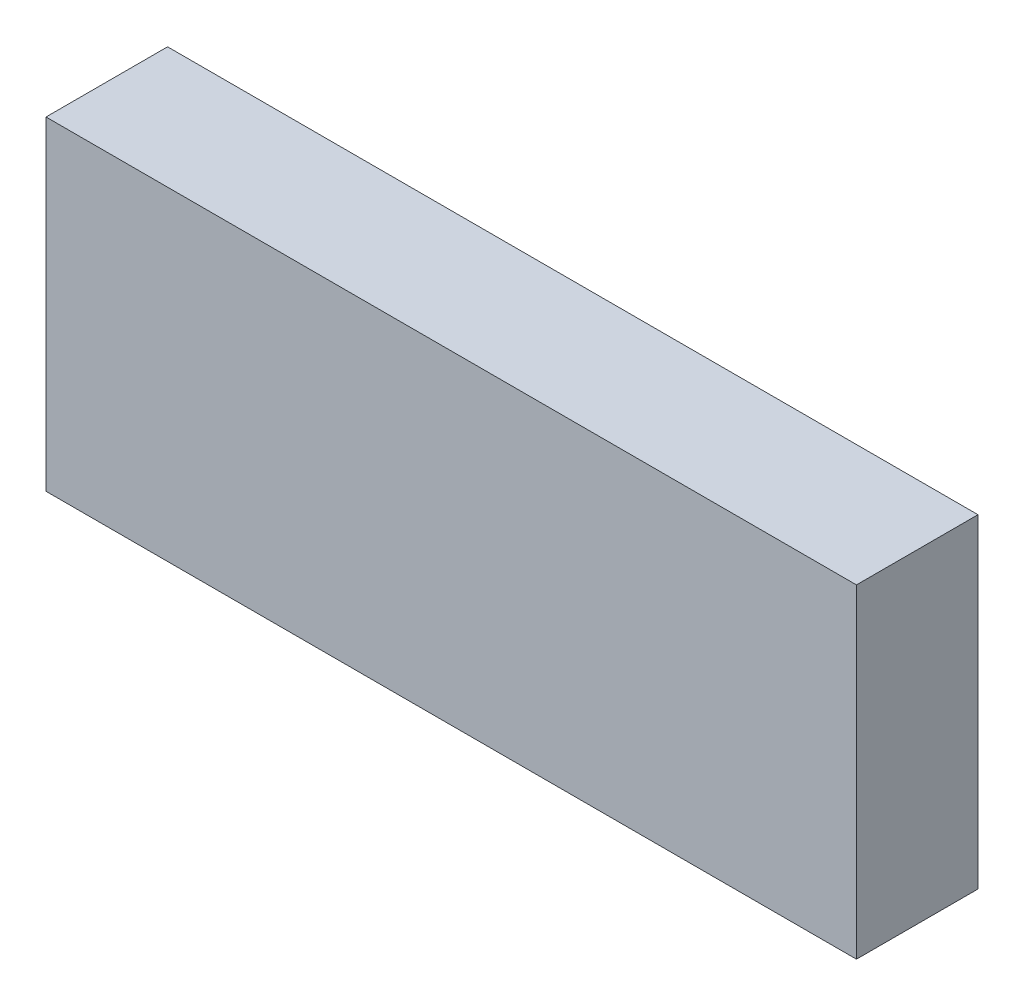
ISO-10303-21;
HEADER;
FILE_DESCRIPTION(('STEP AP214'),'2;1');
FILE_NAME('part.step','',(''),(''),'','','');
FILE_SCHEMA(('AUTOMOTIVE_DESIGN { 1 0 10303 214 1 1 1 1 }'));
ENDSEC;
DATA;
#1=APPLICATION_CONTEXT('core data for automotive mechanical design processes');
#2=APPLICATION_PROTOCOL_DEFINITION('international standard','automotive_design',2000,#1);
#3=PRODUCT_CONTEXT('',#1,'mechanical');
#4=PRODUCT('Part','Part','',(#3));
#5=PRODUCT_RELATED_PRODUCT_CATEGORY('part','',(#4));
#6=PRODUCT_DEFINITION_FORMATION('','',#4);
#7=PRODUCT_DEFINITION_CONTEXT('part definition',#1,'design');
#8=PRODUCT_DEFINITION('design','',#6,#7);
#9=PRODUCT_DEFINITION_SHAPE('','',#8);
#10=(LENGTH_UNIT() NAMED_UNIT(*) SI_UNIT(.MILLI.,.METRE.));
#11=(NAMED_UNIT(*) PLANE_ANGLE_UNIT() SI_UNIT($,.RADIAN.));
#12=(NAMED_UNIT(*) SI_UNIT($,.STERADIAN.) SOLID_ANGLE_UNIT());
#13=UNCERTAINTY_MEASURE_WITH_UNIT(LENGTH_MEASURE(1.E-05),#10,'distance_accuracy_value','');
#14=(GEOMETRIC_REPRESENTATION_CONTEXT(3) GLOBAL_UNCERTAINTY_ASSIGNED_CONTEXT((#13)) GLOBAL_UNIT_ASSIGNED_CONTEXT((#10,
#11,#12)) REPRESENTATION_CONTEXT('',''));
#15=CARTESIAN_POINT('',(0.,0.,0.));
#16=DIRECTION('',(0.,0.,1.));
#17=DIRECTION('',(1.,0.,0.));
#18=AXIS2_PLACEMENT_3D('',#15,#16,#17);
#19=CARTESIAN_POINT('',(100.,40.,15.));
#20=DIRECTION('',(-1.,0.,0.));
#21=DIRECTION('',(0.,-1.,0.));
#22=AXIS2_PLACEMENT_3D('',#19,#20,#21);
#23=PLANE('',#22);
#24=DIRECTION('',(0.,1.,0.));
#25=VECTOR('',#24,1.);
#26=CARTESIAN_POINT('',(100.,40.,-15.));
#27=LINE('',#26,#25);
#28=CARTESIAN_POINT('',(100.,-40.,-15.));
#29=VERTEX_POINT('',#28);
#30=CARTESIAN_POINT('',(100.,40.,-15.));
#31=VERTEX_POINT('',#30);
#32=EDGE_CURVE('E98',#29,#31,#27,.T.);
#33=ORIENTED_EDGE('',*,*,#32,.T.);
#34=DIRECTION('',(0.,0.,-1.));
#35=VECTOR('',#34,1.);
#36=CARTESIAN_POINT('',(100.,40.,15.));
#37=LINE('',#36,#35);
#38=CARTESIAN_POINT('',(100.,40.,15.));
#39=VERTEX_POINT('',#38);
#40=EDGE_CURVE('E11',#39,#31,#37,.T.);
#41=ORIENTED_EDGE('',*,*,#40,.F.);
#42=DIRECTION('',(0.,1.,0.));
#43=VECTOR('',#42,1.);
#44=CARTESIAN_POINT('',(100.,40.,15.));
#45=LINE('',#44,#43);
#46=CARTESIAN_POINT('',(100.,-40.,15.));
#47=VERTEX_POINT('',#46);
#48=EDGE_CURVE('E86',#47,#39,#45,.T.);
#49=ORIENTED_EDGE('',*,*,#48,.F.);
#50=DIRECTION('',(0.,0.,-1.));
#51=VECTOR('',#50,1.);
#52=CARTESIAN_POINT('',(100.,-40.,15.));
#53=LINE('',#52,#51);
#54=EDGE_CURVE('E94',#47,#29,#53,.T.);
#55=ORIENTED_EDGE('',*,*,#54,.T.);
#56=EDGE_LOOP('',(#33,#41,#49,#55));
#57=FACE_BOUND('',#56,.T.);
#58=ADVANCED_FACE('F35',(#57),#23,.F.);
#59=CARTESIAN_POINT('',(-100.,40.,15.));
#60=DIRECTION('',(0.,-1.,0.));
#61=DIRECTION('',(0.,0.,-1.));
#62=AXIS2_PLACEMENT_3D('',#59,#60,#61);
#63=PLANE('',#62);
#64=DIRECTION('',(-1.,0.,0.));
#65=VECTOR('',#64,1.);
#66=CARTESIAN_POINT('',(-100.,40.,-15.));
#67=LINE('',#66,#65);
#68=CARTESIAN_POINT('',(-100.,40.,-15.));
#69=VERTEX_POINT('',#68);
#70=EDGE_CURVE('E90',#31,#69,#67,.T.);
#71=ORIENTED_EDGE('',*,*,#70,.T.);
#72=DIRECTION('',(0.,0.,-1.));
#73=VECTOR('',#72,1.);
#74=CARTESIAN_POINT('',(-100.,40.,15.));
#75=LINE('',#74,#73);
#76=CARTESIAN_POINT('',(-100.,40.,15.));
#77=VERTEX_POINT('',#76);
#78=EDGE_CURVE('E43',#77,#69,#75,.T.);
#79=ORIENTED_EDGE('',*,*,#78,.F.);
#80=DIRECTION('',(-1.,0.,0.));
#81=VECTOR('',#80,1.);
#82=CARTESIAN_POINT('',(-100.,40.,15.));
#83=LINE('',#82,#81);
#84=EDGE_CURVE('E81',#39,#77,#83,.T.);
#85=ORIENTED_EDGE('',*,*,#84,.F.);
#86=ORIENTED_EDGE('',*,*,#40,.T.);
#87=EDGE_LOOP('',(#71,#79,#85,#86));
#88=FACE_BOUND('',#87,.T.);
#89=ADVANCED_FACE('F89',(#88),#63,.F.);
#90=CARTESIAN_POINT('',(-100.,40.,15.));
#91=DIRECTION('',(1.,0.,0.));
#92=DIRECTION('',(0.,1.,0.));
#93=AXIS2_PLACEMENT_3D('',#90,#91,#92);
#94=PLANE('',#93);
#95=DIRECTION('',(0.,-1.,0.));
#96=VECTOR('',#95,1.);
#97=CARTESIAN_POINT('',(-100.,40.,-15.));
#98=LINE('',#97,#96);
#99=CARTESIAN_POINT('',(-100.,-40.,-15.));
#100=VERTEX_POINT('',#99);
#101=EDGE_CURVE('E68',#69,#100,#98,.T.);
#102=ORIENTED_EDGE('',*,*,#101,.T.);
#103=DIRECTION('',(0.,0.,-1.));
#104=VECTOR('',#103,1.);
#105=CARTESIAN_POINT('',(-100.,-40.,15.));
#106=LINE('',#105,#104);
#107=CARTESIAN_POINT('',(-100.,-40.,15.));
#108=VERTEX_POINT('',#107);
#109=EDGE_CURVE('E91',#108,#100,#106,.T.);
#110=ORIENTED_EDGE('',*,*,#109,.F.);
#111=DIRECTION('',(0.,-1.,0.));
#112=VECTOR('',#111,1.);
#113=CARTESIAN_POINT('',(-100.,40.,15.));
#114=LINE('',#113,#112);
#115=EDGE_CURVE('E84',#77,#108,#114,.T.);
#116=ORIENTED_EDGE('',*,*,#115,.F.);
#117=ORIENTED_EDGE('',*,*,#78,.T.);
#118=EDGE_LOOP('',(#102,#110,#116,#117));
#119=FACE_BOUND('',#118,.T.);
#120=ADVANCED_FACE('F92',(#119),#94,.F.);
#121=CARTESIAN_POINT('',(-100.,-40.,15.));
#122=DIRECTION('',(0.,1.,0.));
#123=DIRECTION('',(0.,0.,1.));
#124=AXIS2_PLACEMENT_3D('',#121,#122,#123);
#125=PLANE('',#124);
#126=DIRECTION('',(1.,0.,0.));
#127=VECTOR('',#126,1.);
#128=CARTESIAN_POINT('',(-100.,-40.,-15.));
#129=LINE('',#128,#127);
#130=EDGE_CURVE('E74',#100,#29,#129,.T.);
#131=ORIENTED_EDGE('',*,*,#130,.T.);
#132=ORIENTED_EDGE('',*,*,#54,.F.);
#133=DIRECTION('',(1.,0.,0.));
#134=VECTOR('',#133,1.);
#135=CARTESIAN_POINT('',(-100.,-40.,15.));
#136=LINE('',#135,#134);
#137=EDGE_CURVE('E51',#108,#47,#136,.T.);
#138=ORIENTED_EDGE('',*,*,#137,.F.);
#139=ORIENTED_EDGE('',*,*,#109,.T.);
#140=EDGE_LOOP('',(#131,#132,#138,#139));
#141=FACE_BOUND('',#140,.T.);
#142=ADVANCED_FACE('F105',(#141),#125,.F.);
#143=CARTESIAN_POINT('',(0.,0.,15.));
#144=DIRECTION('',(0.,0.,1.));
#145=DIRECTION('',(1.,0.,0.));
#146=AXIS2_PLACEMENT_3D('',#143,#144,#145);
#147=PLANE('',#146);
#148=ORIENTED_EDGE('',*,*,#48,.T.);
#149=ORIENTED_EDGE('',*,*,#84,.T.);
#150=ORIENTED_EDGE('',*,*,#115,.T.);
#151=ORIENTED_EDGE('',*,*,#137,.T.);
#152=EDGE_LOOP('',(#148,#149,#150,#151));
#153=FACE_BOUND('',#152,.T.);
#154=ADVANCED_FACE('F82',(#153),#147,.T.);
#155=CARTESIAN_POINT('',(0.,0.,-15.));
#156=DIRECTION('',(0.,0.,1.));
#157=DIRECTION('',(1.,0.,0.));
#158=AXIS2_PLACEMENT_3D('',#155,#156,#157);
#159=PLANE('',#158);
#160=ORIENTED_EDGE('',*,*,#32,.F.);
#161=ORIENTED_EDGE('',*,*,#130,.F.);
#162=ORIENTED_EDGE('',*,*,#101,.F.);
#163=ORIENTED_EDGE('',*,*,#70,.F.);
#164=EDGE_LOOP('',(#160,#161,#162,#163));
#165=FACE_BOUND('',#164,.T.);
#166=ADVANCED_FACE('F108',(#165),#159,.F.);
#167=CLOSED_SHELL('',(#58,#89,#120,#142,#154,#166));
#168=MANIFOLD_SOLID_BREP('B2',#167);
#169=ADVANCED_BREP_SHAPE_REPRESENTATION('',(#18,#168),#14);
#170=SHAPE_DEFINITION_REPRESENTATION(#9,#169);
ENDSEC;
END-ISO-10303-21;
